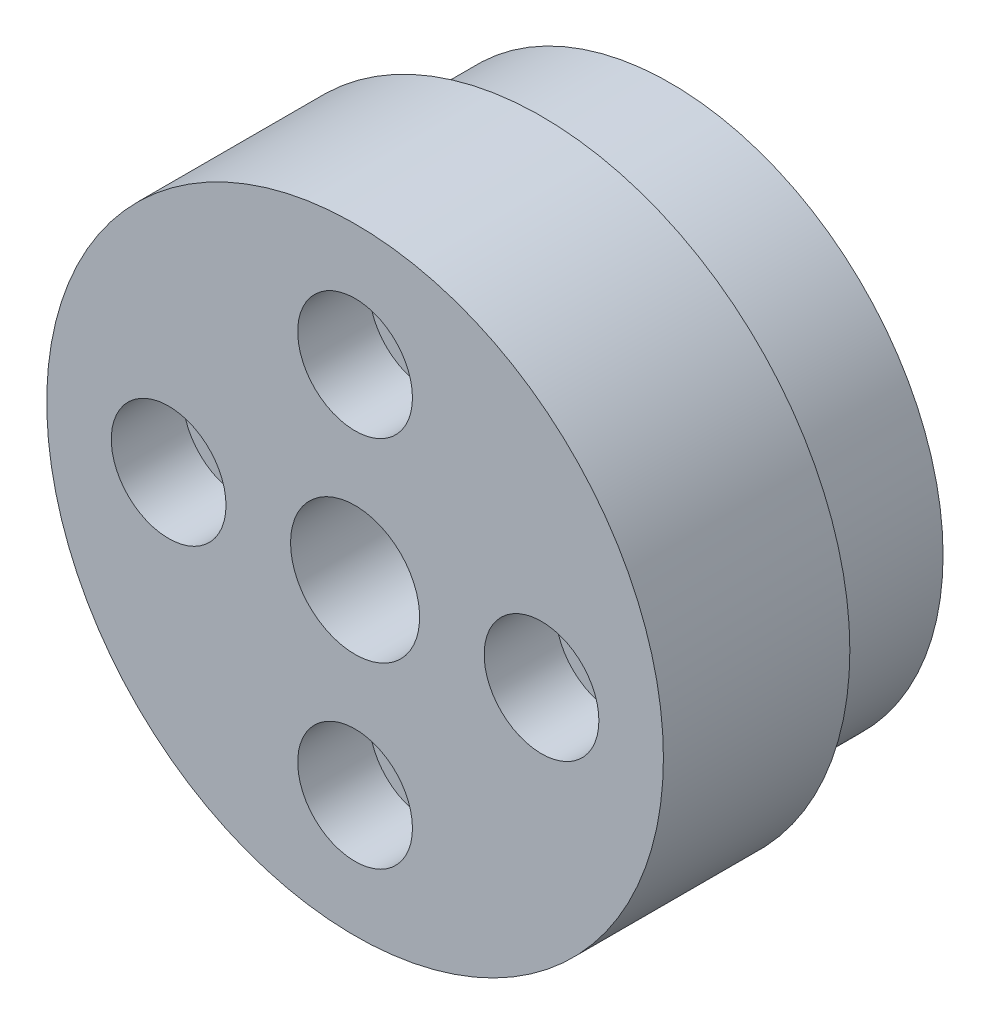
ISO-10303-21;
HEADER;
FILE_DESCRIPTION(('STEP AP214'),'2;1');
FILE_NAME('part.step','',(''),(''),'','','');
FILE_SCHEMA(('AUTOMOTIVE_DESIGN { 1 0 10303 214 1 1 1 1 }'));
ENDSEC;
DATA;
#1=APPLICATION_CONTEXT('core data for automotive mechanical design processes');
#2=APPLICATION_PROTOCOL_DEFINITION('international standard','automotive_design',2000,#1);
#3=PRODUCT_CONTEXT('',#1,'mechanical');
#4=PRODUCT('Part','Part','',(#3));
#5=PRODUCT_RELATED_PRODUCT_CATEGORY('part','',(#4));
#6=PRODUCT_DEFINITION_FORMATION('','',#4);
#7=PRODUCT_DEFINITION_CONTEXT('part definition',#1,'design');
#8=PRODUCT_DEFINITION('design','',#6,#7);
#9=PRODUCT_DEFINITION_SHAPE('','',#8);
#10=(LENGTH_UNIT() NAMED_UNIT(*) SI_UNIT(.MILLI.,.METRE.));
#11=(NAMED_UNIT(*) PLANE_ANGLE_UNIT() SI_UNIT($,.RADIAN.));
#12=(NAMED_UNIT(*) SI_UNIT($,.STERADIAN.) SOLID_ANGLE_UNIT());
#13=UNCERTAINTY_MEASURE_WITH_UNIT(LENGTH_MEASURE(1.E-05),#10,'distance_accuracy_value','');
#14=(GEOMETRIC_REPRESENTATION_CONTEXT(3) GLOBAL_UNCERTAINTY_ASSIGNED_CONTEXT((#13)) GLOBAL_UNIT_ASSIGNED_CONTEXT((#10,
#11,#12)) REPRESENTATION_CONTEXT('',''));
#15=CARTESIAN_POINT('',(0.,0.,0.));
#16=DIRECTION('',(0.,0.,1.));
#17=DIRECTION('',(1.,0.,0.));
#18=AXIS2_PLACEMENT_3D('',#15,#16,#17);
#19=CARTESIAN_POINT('',(0.,-6.5,0.));
#20=DIRECTION('',(0.,0.,-1.));
#21=DIRECTION('',(-1.,0.,0.));
#22=AXIS2_PLACEMENT_3D('',#19,#20,#21);
#23=CYLINDRICAL_SURFACE('',#22,1.35);
#24=CARTESIAN_POINT('',(0.,-6.5,-11.));
#25=DIRECTION('',(0.,0.,-1.));
#26=DIRECTION('',(-1.,0.,0.));
#27=AXIS2_PLACEMENT_3D('',#24,#25,#26);
#28=CIRCLE('',#27,1.35);
#29=CARTESIAN_POINT('',(-1.35,-6.5,-11.));
#30=VERTEX_POINT('',#29);
#31=EDGE_CURVE('E71',#30,#30,#28,.T.);
#32=ORIENTED_EDGE('',*,*,#31,.T.);
#33=EDGE_LOOP('',(#32));
#34=FACE_BOUND('',#33,.T.);
#35=CARTESIAN_POINT('',(0.,-6.5,-2.5));
#36=DIRECTION('',(0.,0.,1.));
#37=DIRECTION('',(1.,0.,0.));
#38=AXIS2_PLACEMENT_3D('',#35,#36,#37);
#39=CIRCLE('',#38,1.35);
#40=CARTESIAN_POINT('',(1.35,-6.5,-2.5));
#41=VERTEX_POINT('',#40);
#42=EDGE_CURVE('E86',#41,#41,#39,.T.);
#43=ORIENTED_EDGE('',*,*,#42,.T.);
#44=EDGE_LOOP('',(#43));
#45=FACE_BOUND('',#44,.T.);
#46=ADVANCED_FACE('F35',(#34,#45),#23,.F.);
#47=CARTESIAN_POINT('',(-6.5,0.,0.));
#48=DIRECTION('',(0.,0.,-1.));
#49=DIRECTION('',(-1.,0.,0.));
#50=AXIS2_PLACEMENT_3D('',#47,#48,#49);
#51=CYLINDRICAL_SURFACE('',#50,1.35);
#52=CARTESIAN_POINT('',(-6.5,0.,-11.));
#53=DIRECTION('',(0.,0.,-1.));
#54=DIRECTION('',(-1.,0.,0.));
#55=AXIS2_PLACEMENT_3D('',#52,#53,#54);
#56=CIRCLE('',#55,1.35);
#57=CARTESIAN_POINT('',(-7.85,0.,-11.));
#58=VERTEX_POINT('',#57);
#59=EDGE_CURVE('E64',#58,#58,#56,.T.);
#60=ORIENTED_EDGE('',*,*,#59,.T.);
#61=EDGE_LOOP('',(#60));
#62=FACE_BOUND('',#61,.T.);
#63=CARTESIAN_POINT('',(-6.5,0.,-2.5));
#64=DIRECTION('',(0.,0.,1.));
#65=DIRECTION('',(1.,0.,0.));
#66=AXIS2_PLACEMENT_3D('',#63,#64,#65);
#67=CIRCLE('',#66,1.35);
#68=CARTESIAN_POINT('',(-5.15,0.,-2.5));
#69=VERTEX_POINT('',#68);
#70=EDGE_CURVE('E89',#69,#69,#67,.T.);
#71=ORIENTED_EDGE('',*,*,#70,.T.);
#72=EDGE_LOOP('',(#71));
#73=FACE_BOUND('',#72,.T.);
#74=ADVANCED_FACE('F162',(#62,#73),#51,.F.);
#75=CARTESIAN_POINT('',(6.5,0.,0.));
#76=DIRECTION('',(0.,0.,-1.));
#77=DIRECTION('',(-1.,0.,0.));
#78=AXIS2_PLACEMENT_3D('',#75,#76,#77);
#79=CYLINDRICAL_SURFACE('',#78,1.35);
#80=CARTESIAN_POINT('',(6.5,0.,-11.));
#81=DIRECTION('',(0.,0.,-1.));
#82=DIRECTION('',(-1.,0.,0.));
#83=AXIS2_PLACEMENT_3D('',#80,#81,#82);
#84=CIRCLE('',#83,1.35);
#85=CARTESIAN_POINT('',(5.15,0.,-11.));
#86=VERTEX_POINT('',#85);
#87=EDGE_CURVE('E59',#86,#86,#84,.T.);
#88=ORIENTED_EDGE('',*,*,#87,.T.);
#89=EDGE_LOOP('',(#88));
#90=FACE_BOUND('',#89,.T.);
#91=CARTESIAN_POINT('',(6.5,0.,-2.5));
#92=DIRECTION('',(0.,0.,1.));
#93=DIRECTION('',(1.,0.,0.));
#94=AXIS2_PLACEMENT_3D('',#91,#92,#93);
#95=CIRCLE('',#94,1.35);
#96=CARTESIAN_POINT('',(7.85,0.,-2.5));
#97=VERTEX_POINT('',#96);
#98=EDGE_CURVE('E107',#97,#97,#95,.T.);
#99=ORIENTED_EDGE('',*,*,#98,.T.);
#100=EDGE_LOOP('',(#99));
#101=FACE_BOUND('',#100,.T.);
#102=ADVANCED_FACE('F118',(#90,#101),#79,.F.);
#103=CARTESIAN_POINT('',(0.,6.5,0.));
#104=DIRECTION('',(0.,0.,-1.));
#105=DIRECTION('',(-1.,0.,0.));
#106=AXIS2_PLACEMENT_3D('',#103,#104,#105);
#107=CYLINDRICAL_SURFACE('',#106,1.35);
#108=CARTESIAN_POINT('',(0.,6.5,-11.));
#109=DIRECTION('',(0.,0.,-1.));
#110=DIRECTION('',(-1.,0.,0.));
#111=AXIS2_PLACEMENT_3D('',#108,#109,#110);
#112=CIRCLE('',#111,1.35);
#113=CARTESIAN_POINT('',(-1.35,6.5,-11.));
#114=VERTEX_POINT('',#113);
#115=EDGE_CURVE('E55',#114,#114,#112,.T.);
#116=ORIENTED_EDGE('',*,*,#115,.T.);
#117=EDGE_LOOP('',(#116));
#118=FACE_BOUND('',#117,.T.);
#119=CARTESIAN_POINT('',(0.,6.5,-2.5));
#120=DIRECTION('',(0.,0.,1.));
#121=DIRECTION('',(1.,0.,0.));
#122=AXIS2_PLACEMENT_3D('',#119,#120,#121);
#123=CIRCLE('',#122,1.35);
#124=CARTESIAN_POINT('',(1.35,6.5,-2.5));
#125=VERTEX_POINT('',#124);
#126=EDGE_CURVE('E98',#125,#125,#123,.T.);
#127=ORIENTED_EDGE('',*,*,#126,.T.);
#128=EDGE_LOOP('',(#127));
#129=FACE_BOUND('',#128,.T.);
#130=ADVANCED_FACE('F184',(#118,#129),#107,.F.);
#131=CARTESIAN_POINT('',(0.,0.,-11.));
#132=DIRECTION('',(0.,0.,1.));
#133=DIRECTION('',(1.,0.,0.));
#134=AXIS2_PLACEMENT_3D('',#131,#132,#133);
#135=CYLINDRICAL_SURFACE('',#134,9.5);
#136=CARTESIAN_POINT('',(0.,0.,-11.));
#137=DIRECTION('',(0.,0.,1.));
#138=DIRECTION('',(1.,0.,0.));
#139=AXIS2_PLACEMENT_3D('',#136,#137,#138);
#140=CIRCLE('',#139,9.5);
#141=CARTESIAN_POINT('',(9.5,0.,-11.));
#142=VERTEX_POINT('',#141);
#143=EDGE_CURVE('E10',#142,#142,#140,.T.);
#144=ORIENTED_EDGE('',*,*,#143,.T.);
#145=EDGE_LOOP('',(#144));
#146=FACE_BOUND('',#145,.T.);
#147=CARTESIAN_POINT('',(0.,0.,-6.5));
#148=DIRECTION('',(0.,0.,1.));
#149=DIRECTION('',(1.,0.,0.));
#150=AXIS2_PLACEMENT_3D('',#147,#148,#149);
#151=CIRCLE('',#150,9.5);
#152=CARTESIAN_POINT('',(9.5,0.,-6.5));
#153=VERTEX_POINT('',#152);
#154=EDGE_CURVE('E46',#153,#153,#151,.T.);
#155=ORIENTED_EDGE('',*,*,#154,.F.);
#156=EDGE_LOOP('',(#155));
#157=FACE_BOUND('',#156,.T.);
#158=ADVANCED_FACE('F37',(#146,#157),#135,.T.);
#159=CARTESIAN_POINT('',(0.,0.,-11.));
#160=DIRECTION('',(0.,0.,1.));
#161=DIRECTION('',(1.,0.,0.));
#162=AXIS2_PLACEMENT_3D('',#159,#160,#161);
#163=PLANE('',#162);
#164=CARTESIAN_POINT('',(0.,0.,-11.));
#165=DIRECTION('',(0.,0.,-1.));
#166=DIRECTION('',(-1.,0.,0.));
#167=AXIS2_PLACEMENT_3D('',#164,#165,#166);
#168=CIRCLE('',#167,2.25);
#169=CARTESIAN_POINT('',(-2.25,0.,-11.));
#170=VERTEX_POINT('',#169);
#171=EDGE_CURVE('E67',#170,#170,#168,.T.);
#172=ORIENTED_EDGE('',*,*,#171,.F.);
#173=EDGE_LOOP('',(#172));
#174=FACE_BOUND('',#173,.T.);
#175=ORIENTED_EDGE('',*,*,#115,.F.);
#176=EDGE_LOOP('',(#175));
#177=FACE_BOUND('',#176,.T.);
#178=ORIENTED_EDGE('',*,*,#87,.F.);
#179=EDGE_LOOP('',(#178));
#180=FACE_BOUND('',#179,.T.);
#181=ORIENTED_EDGE('',*,*,#59,.F.);
#182=EDGE_LOOP('',(#181));
#183=FACE_BOUND('',#182,.T.);
#184=ORIENTED_EDGE('',*,*,#31,.F.);
#185=EDGE_LOOP('',(#184));
#186=FACE_BOUND('',#185,.T.);
#187=ORIENTED_EDGE('',*,*,#143,.F.);
#188=EDGE_LOOP('',(#187));
#189=FACE_BOUND('',#188,.T.);
#190=ADVANCED_FACE('F178',(#174,#177,#180,#183,#186,#189),#163,.F.);
#191=CARTESIAN_POINT('',(0.,0.,-6.5));
#192=DIRECTION('',(0.,0.,1.));
#193=DIRECTION('',(1.,0.,0.));
#194=AXIS2_PLACEMENT_3D('',#191,#192,#193);
#195=CYLINDRICAL_SURFACE('',#194,10.75);
#196=CARTESIAN_POINT('',(0.,0.,-6.5));
#197=DIRECTION('',(0.,0.,1.));
#198=DIRECTION('',(1.,0.,0.));
#199=AXIS2_PLACEMENT_3D('',#196,#197,#198);
#200=CIRCLE('',#199,10.75);
#201=CARTESIAN_POINT('',(10.75,0.,-6.5));
#202=VERTEX_POINT('',#201);
#203=EDGE_CURVE('E42',#202,#202,#200,.T.);
#204=CARTESIAN_POINT('',(0.,0.,0.));
#205=DIRECTION('',(0.,0.,1.));
#206=DIRECTION('',(1.,0.,0.));
#207=AXIS2_PLACEMENT_3D('',#204,#205,#206);
#208=CIRCLE('',#207,10.75);
#209=CARTESIAN_POINT('',(10.75,0.,0.));
#210=VERTEX_POINT('',#209);
#211=EDGE_CURVE('E51',#210,#210,#208,.T.);
#212=CARTESIAN_POINT('',(10.75,0.,-6.5));
#213=CARTESIAN_POINT('',(10.75,0.,-6.43229166666667));
#214=CARTESIAN_POINT('',(10.75,0.,-6.36458333333333));
#215=CARTESIAN_POINT('',(10.75,0.,-6.22916666666667));
#216=CARTESIAN_POINT('',(10.75,0.,-6.16145833333333));
#217=CARTESIAN_POINT('',(10.75,0.,-6.02604166666667));
#218=CARTESIAN_POINT('',(10.75,0.,-5.95833333333333));
#219=CARTESIAN_POINT('',(10.75,0.,-5.82291666666667));
#220=CARTESIAN_POINT('',(10.75,0.,-5.75520833333333));
#221=CARTESIAN_POINT('',(10.75,0.,-5.61979166666667));
#222=CARTESIAN_POINT('',(10.75,0.,-5.55208333333333));
#223=CARTESIAN_POINT('',(10.75,0.,-5.41666666666667));
#224=CARTESIAN_POINT('',(10.75,0.,-5.34895833333333));
#225=CARTESIAN_POINT('',(10.75,0.,-5.21354166666667));
#226=CARTESIAN_POINT('',(10.75,0.,-5.14583333333333));
#227=CARTESIAN_POINT('',(10.75,0.,-5.01041666666667));
#228=CARTESIAN_POINT('',(10.75,0.,-4.94270833333333));
#229=CARTESIAN_POINT('',(10.75,0.,-4.80729166666667));
#230=CARTESIAN_POINT('',(10.75,0.,-4.73958333333333));
#231=CARTESIAN_POINT('',(10.75,0.,-4.60416666666667));
#232=CARTESIAN_POINT('',(10.75,0.,-4.53645833333333));
#233=CARTESIAN_POINT('',(10.75,0.,-4.40104166666667));
#234=CARTESIAN_POINT('',(10.75,0.,-4.33333333333333));
#235=CARTESIAN_POINT('',(10.75,0.,-4.19791666666667));
#236=CARTESIAN_POINT('',(10.75,0.,-4.13020833333333));
#237=CARTESIAN_POINT('',(10.75,0.,-3.99479166666667));
#238=CARTESIAN_POINT('',(10.75,0.,-3.92708333333333));
#239=CARTESIAN_POINT('',(10.75,0.,-3.79166666666667));
#240=CARTESIAN_POINT('',(10.75,0.,-3.72395833333333));
#241=CARTESIAN_POINT('',(10.75,0.,-3.58854166666667));
#242=CARTESIAN_POINT('',(10.75,0.,-3.52083333333333));
#243=CARTESIAN_POINT('',(10.75,0.,-3.38541666666667));
#244=CARTESIAN_POINT('',(10.75,0.,-3.31770833333333));
#245=CARTESIAN_POINT('',(10.75,0.,-3.18229166666667));
#246=CARTESIAN_POINT('',(10.75,0.,-3.11458333333333));
#247=CARTESIAN_POINT('',(10.75,0.,-2.97916666666667));
#248=CARTESIAN_POINT('',(10.75,0.,-2.91145833333333));
#249=CARTESIAN_POINT('',(10.75,0.,-2.77604166666667));
#250=CARTESIAN_POINT('',(10.75,0.,-2.70833333333333));
#251=CARTESIAN_POINT('',(10.75,0.,-2.57291666666667));
#252=CARTESIAN_POINT('',(10.75,0.,-2.50520833333333));
#253=CARTESIAN_POINT('',(10.75,0.,-2.36979166666667));
#254=CARTESIAN_POINT('',(10.75,0.,-2.30208333333333));
#255=CARTESIAN_POINT('',(10.75,0.,-2.16666666666667));
#256=CARTESIAN_POINT('',(10.75,0.,-2.09895833333333));
#257=CARTESIAN_POINT('',(10.75,0.,-1.96354166666667));
#258=CARTESIAN_POINT('',(10.75,0.,-1.89583333333333));
#259=CARTESIAN_POINT('',(10.75,0.,-1.76041666666667));
#260=CARTESIAN_POINT('',(10.75,0.,-1.69270833333333));
#261=CARTESIAN_POINT('',(10.75,0.,-1.55729166666667));
#262=CARTESIAN_POINT('',(10.75,0.,-1.48958333333333));
#263=CARTESIAN_POINT('',(10.75,0.,-1.35416666666667));
#264=CARTESIAN_POINT('',(10.75,0.,-1.28645833333333));
#265=CARTESIAN_POINT('',(10.75,0.,-1.15104166666667));
#266=CARTESIAN_POINT('',(10.75,0.,-1.08333333333333));
#267=CARTESIAN_POINT('',(10.75,0.,-0.947916666666667));
#268=CARTESIAN_POINT('',(10.75,0.,-0.880208333333333));
#269=CARTESIAN_POINT('',(10.75,0.,-0.744791666666667));
#270=CARTESIAN_POINT('',(10.75,0.,-0.677083333333333));
#271=CARTESIAN_POINT('',(10.75,0.,-0.541666666666667));
#272=CARTESIAN_POINT('',(10.75,0.,-0.473958333333333));
#273=CARTESIAN_POINT('',(10.75,0.,-0.338541666666667));
#274=CARTESIAN_POINT('',(10.75,0.,-0.270833333333334));
#275=CARTESIAN_POINT('',(10.75,0.,-0.135416666666667));
#276=CARTESIAN_POINT('',(10.75,0.,-0.0677083333333334));
#277=CARTESIAN_POINT('',(10.75,0.,0.));
#278=B_SPLINE_CURVE_WITH_KNOTS('',3,(#212,#213,#214,#215,#216,#217,#218,#219,#220,#221,#222,
#223,#224,#225,#226,#227,#228,#229,#230,#231,#232,#233,#234,#235,#236,#237,#238,#239,#240,#241,
#242,#243,#244,#245,#246,#247,#248,#249,#250,#251,#252,#253,#254,#255,#256,#257,#258,#259,#260,
#261,#262,#263,#264,#265,#266,#267,#268,#269,#270,#271,#272,#273,#274,#275,#276,#277),
.UNSPECIFIED.,.F.,.F.,(4,2,2,2,2,2,2,2,2,2,2,2,2,2,2,2,2,2,2,2,2,2,2,2,2,2,2,2,2,2,2,2,4),(0.,
0.203124999999999,0.40625,0.609375,0.8125,1.015625,1.21875,1.421875,1.625,1.828125,2.03125,
2.234375,2.4375,2.640625,2.84375,3.046875,3.25,3.453125,3.65625,3.859375,4.0625,4.265625,
4.46875,4.671875,4.875,5.078125,5.28125,5.484375,5.6875,5.890625,6.09375,6.296875,6.5),.UNSPECIFIED.);
#279=EDGE_CURVE('BSEAM174',#202,#210,#278,.T.);
#280=ORIENTED_EDGE('',*,*,#203,.T.);
#281=ORIENTED_EDGE('',*,*,#211,.F.);
#282=ORIENTED_EDGE('',*,*,#279,.T.);
#283=ORIENTED_EDGE('',*,*,#279,.F.);
#284=EDGE_LOOP('',(#280,#282,#281,#283));
#285=FACE_BOUND('',#284,.T.);
#286=ADVANCED_FACE('F174',(#285),#195,.T.);
#287=CARTESIAN_POINT('',(0.,0.,-6.5));
#288=DIRECTION('',(0.,0.,1.));
#289=DIRECTION('',(1.,0.,0.));
#290=AXIS2_PLACEMENT_3D('',#287,#288,#289);
#291=PLANE('',#290);
#292=ORIENTED_EDGE('',*,*,#154,.T.);
#293=EDGE_LOOP('',(#292));
#294=FACE_BOUND('',#293,.T.);
#295=ORIENTED_EDGE('',*,*,#203,.F.);
#296=EDGE_LOOP('',(#295));
#297=FACE_BOUND('',#296,.T.);
#298=ADVANCED_FACE('F138',(#294,#297),#291,.F.);
#299=CARTESIAN_POINT('',(0.,0.,0.));
#300=DIRECTION('',(0.,0.,1.));
#301=DIRECTION('',(1.,0.,0.));
#302=AXIS2_PLACEMENT_3D('',#299,#300,#301);
#303=PLANE('',#302);
#304=CARTESIAN_POINT('',(6.5,0.,0.));
#305=DIRECTION('',(0.,0.,1.));
#306=DIRECTION('',(1.,0.,0.));
#307=AXIS2_PLACEMENT_3D('',#304,#305,#306);
#308=CIRCLE('',#307,2.);
#309=CARTESIAN_POINT('',(8.5,0.,0.));
#310=VERTEX_POINT('',#309);
#311=EDGE_CURVE('E110',#310,#310,#308,.T.);
#312=ORIENTED_EDGE('',*,*,#311,.F.);
#313=EDGE_LOOP('',(#312));
#314=FACE_BOUND('',#313,.T.);
#315=CARTESIAN_POINT('',(0.,6.5,0.));
#316=DIRECTION('',(0.,0.,1.));
#317=DIRECTION('',(1.,0.,0.));
#318=AXIS2_PLACEMENT_3D('',#315,#316,#317);
#319=CIRCLE('',#318,2.);
#320=CARTESIAN_POINT('',(2.,6.5,0.));
#321=VERTEX_POINT('',#320);
#322=EDGE_CURVE('E101',#321,#321,#319,.T.);
#323=ORIENTED_EDGE('',*,*,#322,.F.);
#324=EDGE_LOOP('',(#323));
#325=FACE_BOUND('',#324,.T.);
#326=CARTESIAN_POINT('',(-6.5,0.,0.));
#327=DIRECTION('',(0.,0.,1.));
#328=DIRECTION('',(1.,0.,0.));
#329=AXIS2_PLACEMENT_3D('',#326,#327,#328);
#330=CIRCLE('',#329,2.);
#331=CARTESIAN_POINT('',(-4.5,0.,0.));
#332=VERTEX_POINT('',#331);
#333=EDGE_CURVE('E92',#332,#332,#330,.T.);
#334=ORIENTED_EDGE('',*,*,#333,.F.);
#335=EDGE_LOOP('',(#334));
#336=FACE_BOUND('',#335,.T.);
#337=CARTESIAN_POINT('',(0.,-6.5,0.));
#338=DIRECTION('',(0.,0.,1.));
#339=DIRECTION('',(1.,0.,0.));
#340=AXIS2_PLACEMENT_3D('',#337,#338,#339);
#341=CIRCLE('',#340,2.);
#342=CARTESIAN_POINT('',(2.,-6.5,0.));
#343=VERTEX_POINT('',#342);
#344=EDGE_CURVE('E82',#343,#343,#341,.T.);
#345=ORIENTED_EDGE('',*,*,#344,.F.);
#346=EDGE_LOOP('',(#345));
#347=FACE_BOUND('',#346,.T.);
#348=CARTESIAN_POINT('',(0.,0.,0.));
#349=DIRECTION('',(0.,0.,-1.));
#350=DIRECTION('',(-1.,0.,0.));
#351=AXIS2_PLACEMENT_3D('',#348,#349,#350);
#352=CIRCLE('',#351,2.25);
#353=CARTESIAN_POINT('',(-2.25,0.,0.));
#354=VERTEX_POINT('',#353);
#355=EDGE_CURVE('E73',#354,#354,#352,.T.);
#356=ORIENTED_EDGE('',*,*,#355,.T.);
#357=EDGE_LOOP('',(#356));
#358=FACE_BOUND('',#357,.T.);
#359=ORIENTED_EDGE('',*,*,#211,.T.);
#360=EDGE_LOOP('',(#359));
#361=FACE_BOUND('',#360,.T.);
#362=ADVANCED_FACE('F134',(#314,#325,#336,#347,#358,#361),#303,.T.);
#363=CARTESIAN_POINT('',(0.,0.,0.));
#364=DIRECTION('',(0.,0.,-1.));
#365=DIRECTION('',(-1.,0.,0.));
#366=AXIS2_PLACEMENT_3D('',#363,#364,#365);
#367=CYLINDRICAL_SURFACE('',#366,2.25);
#368=ORIENTED_EDGE('',*,*,#355,.F.);
#369=EDGE_LOOP('',(#368));
#370=FACE_BOUND('',#369,.T.);
#371=ORIENTED_EDGE('',*,*,#171,.T.);
#372=EDGE_LOOP('',(#371));
#373=FACE_BOUND('',#372,.T.);
#374=ADVANCED_FACE('F137',(#370,#373),#367,.F.);
#375=CARTESIAN_POINT('',(0.,6.5,-2.5));
#376=DIRECTION('',(0.,0.,1.));
#377=DIRECTION('',(1.,0.,0.));
#378=AXIS2_PLACEMENT_3D('',#375,#376,#377);
#379=CYLINDRICAL_SURFACE('',#378,2.);
#380=CARTESIAN_POINT('',(0.,6.5,-2.5));
#381=DIRECTION('',(0.,0.,1.));
#382=DIRECTION('',(1.,0.,0.));
#383=AXIS2_PLACEMENT_3D('',#380,#381,#382);
#384=CIRCLE('',#383,2.);
#385=CARTESIAN_POINT('',(2.,6.5,-2.5));
#386=VERTEX_POINT('',#385);
#387=EDGE_CURVE('E104',#386,#386,#384,.T.);
#388=ORIENTED_EDGE('',*,*,#387,.F.);
#389=EDGE_LOOP('',(#388));
#390=FACE_BOUND('',#389,.T.);
#391=ORIENTED_EDGE('',*,*,#322,.T.);
#392=EDGE_LOOP('',(#391));
#393=FACE_BOUND('',#392,.T.);
#394=ADVANCED_FACE('F204',(#390,#393),#379,.F.);
#395=CARTESIAN_POINT('',(0.,6.5,-2.5));
#396=DIRECTION('',(0.,0.,1.));
#397=DIRECTION('',(1.,0.,0.));
#398=AXIS2_PLACEMENT_3D('',#395,#396,#397);
#399=PLANE('',#398);
#400=ORIENTED_EDGE('',*,*,#126,.F.);
#401=EDGE_LOOP('',(#400));
#402=FACE_BOUND('',#401,.T.);
#403=ORIENTED_EDGE('',*,*,#387,.T.);
#404=EDGE_LOOP('',(#403));
#405=FACE_BOUND('',#404,.T.);
#406=ADVANCED_FACE('F130',(#402,#405),#399,.T.);
#407=CARTESIAN_POINT('',(6.5,0.,-2.5));
#408=DIRECTION('',(0.,0.,1.));
#409=DIRECTION('',(1.,0.,0.));
#410=AXIS2_PLACEMENT_3D('',#407,#408,#409);
#411=CYLINDRICAL_SURFACE('',#410,2.);
#412=CARTESIAN_POINT('',(6.5,0.,-2.5));
#413=DIRECTION('',(0.,0.,1.));
#414=DIRECTION('',(1.,0.,0.));
#415=AXIS2_PLACEMENT_3D('',#412,#413,#414);
#416=CIRCLE('',#415,2.);
#417=CARTESIAN_POINT('',(8.5,0.,-2.5));
#418=VERTEX_POINT('',#417);
#419=EDGE_CURVE('E80',#418,#418,#416,.T.);
#420=ORIENTED_EDGE('',*,*,#419,.F.);
#421=EDGE_LOOP('',(#420));
#422=FACE_BOUND('',#421,.T.);
#423=ORIENTED_EDGE('',*,*,#311,.T.);
#424=EDGE_LOOP('',(#423));
#425=FACE_BOUND('',#424,.T.);
#426=ADVANCED_FACE('F124',(#422,#425),#411,.F.);
#427=CARTESIAN_POINT('',(6.5,0.,-2.5));
#428=DIRECTION('',(0.,0.,1.));
#429=DIRECTION('',(1.,0.,0.));
#430=AXIS2_PLACEMENT_3D('',#427,#428,#429);
#431=PLANE('',#430);
#432=ORIENTED_EDGE('',*,*,#98,.F.);
#433=EDGE_LOOP('',(#432));
#434=FACE_BOUND('',#433,.T.);
#435=ORIENTED_EDGE('',*,*,#419,.T.);
#436=EDGE_LOOP('',(#435));
#437=FACE_BOUND('',#436,.T.);
#438=ADVANCED_FACE('F120',(#434,#437),#431,.T.);
#439=CARTESIAN_POINT('',(-6.5,0.,-2.5));
#440=DIRECTION('',(0.,0.,1.));
#441=DIRECTION('',(1.,0.,0.));
#442=AXIS2_PLACEMENT_3D('',#439,#440,#441);
#443=CYLINDRICAL_SURFACE('',#442,2.);
#444=CARTESIAN_POINT('',(-6.5,0.,-2.5));
#445=DIRECTION('',(0.,0.,1.));
#446=DIRECTION('',(1.,0.,0.));
#447=AXIS2_PLACEMENT_3D('',#444,#445,#446);
#448=CIRCLE('',#447,2.);
#449=CARTESIAN_POINT('',(-4.5,0.,-2.5));
#450=VERTEX_POINT('',#449);
#451=EDGE_CURVE('E95',#450,#450,#448,.T.);
#452=ORIENTED_EDGE('',*,*,#451,.F.);
#453=EDGE_LOOP('',(#452));
#454=FACE_BOUND('',#453,.T.);
#455=ORIENTED_EDGE('',*,*,#333,.T.);
#456=EDGE_LOOP('',(#455));
#457=FACE_BOUND('',#456,.T.);
#458=ADVANCED_FACE('F123',(#454,#457),#443,.F.);
#459=CARTESIAN_POINT('',(-6.5,0.,-2.5));
#460=DIRECTION('',(0.,0.,1.));
#461=DIRECTION('',(1.,0.,0.));
#462=AXIS2_PLACEMENT_3D('',#459,#460,#461);
#463=PLANE('',#462);
#464=ORIENTED_EDGE('',*,*,#70,.F.);
#465=EDGE_LOOP('',(#464));
#466=FACE_BOUND('',#465,.T.);
#467=ORIENTED_EDGE('',*,*,#451,.T.);
#468=EDGE_LOOP('',(#467));
#469=FACE_BOUND('',#468,.T.);
#470=ADVANCED_FACE('F148',(#466,#469),#463,.T.);
#471=CARTESIAN_POINT('',(0.,-6.5,-2.5));
#472=DIRECTION('',(0.,0.,1.));
#473=DIRECTION('',(1.,0.,0.));
#474=AXIS2_PLACEMENT_3D('',#471,#472,#473);
#475=CYLINDRICAL_SURFACE('',#474,2.);
#476=CARTESIAN_POINT('',(0.,-6.5,-2.5));
#477=DIRECTION('',(0.,0.,1.));
#478=DIRECTION('',(1.,0.,0.));
#479=AXIS2_PLACEMENT_3D('',#476,#477,#478);
#480=CIRCLE('',#479,2.);
#481=CARTESIAN_POINT('',(2.,-6.5,-2.5));
#482=VERTEX_POINT('',#481);
#483=EDGE_CURVE('E85',#482,#482,#480,.T.);
#484=ORIENTED_EDGE('',*,*,#483,.F.);
#485=EDGE_LOOP('',(#484));
#486=FACE_BOUND('',#485,.T.);
#487=ORIENTED_EDGE('',*,*,#344,.T.);
#488=EDGE_LOOP('',(#487));
#489=FACE_BOUND('',#488,.T.);
#490=ADVANCED_FACE('F145',(#486,#489),#475,.F.);
#491=CARTESIAN_POINT('',(0.,-6.5,-2.5));
#492=DIRECTION('',(0.,0.,1.));
#493=DIRECTION('',(1.,0.,0.));
#494=AXIS2_PLACEMENT_3D('',#491,#492,#493);
#495=PLANE('',#494);
#496=ORIENTED_EDGE('',*,*,#42,.F.);
#497=EDGE_LOOP('',(#496));
#498=FACE_BOUND('',#497,.T.);
#499=ORIENTED_EDGE('',*,*,#483,.T.);
#500=EDGE_LOOP('',(#499));
#501=FACE_BOUND('',#500,.T.);
#502=ADVANCED_FACE('F147',(#498,#501),#495,.T.);
#503=CLOSED_SHELL('',(#46,#74,#102,#130,#158,#190,#286,#298,#362,#374,#394,#406,#426,#438,#458,
#470,#490,#502));
#504=MANIFOLD_SOLID_BREP('B2',#503);
#505=ADVANCED_BREP_SHAPE_REPRESENTATION('',(#18,#504),#14);
#506=SHAPE_DEFINITION_REPRESENTATION(#9,#505);
ENDSEC;
END-ISO-10303-21;
